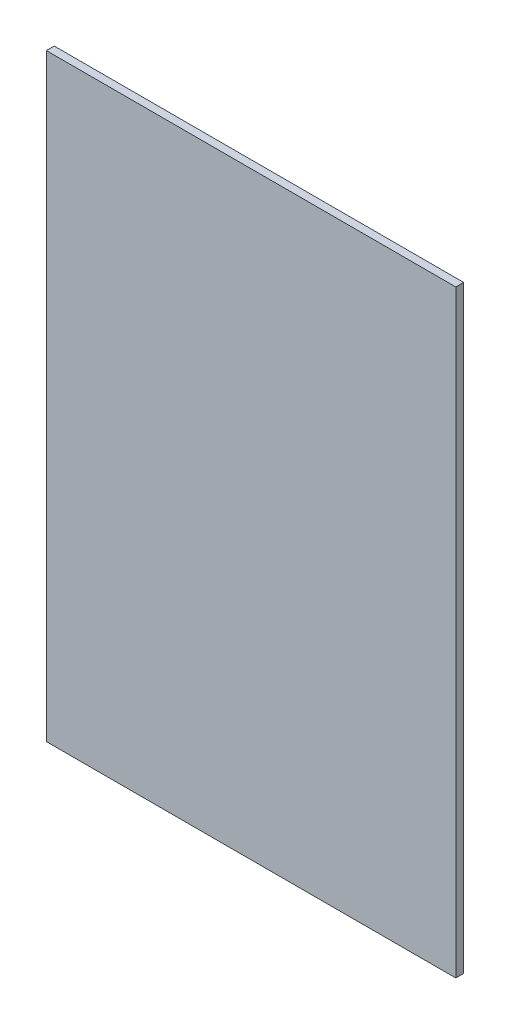
ISO-10303-21;
HEADER;
FILE_DESCRIPTION(('STEP AP214'),'2;1');
FILE_NAME('part.step','',(''),(''),'','','');
FILE_SCHEMA(('AUTOMOTIVE_DESIGN { 1 0 10303 214 1 1 1 1 }'));
ENDSEC;
DATA;
#1=APPLICATION_CONTEXT('core data for automotive mechanical design processes');
#2=APPLICATION_PROTOCOL_DEFINITION('international standard','automotive_design',2000,#1);
#3=PRODUCT_CONTEXT('',#1,'mechanical');
#4=PRODUCT('Part','Part','',(#3));
#5=PRODUCT_RELATED_PRODUCT_CATEGORY('part','',(#4));
#6=PRODUCT_DEFINITION_FORMATION('','',#4);
#7=PRODUCT_DEFINITION_CONTEXT('part definition',#1,'design');
#8=PRODUCT_DEFINITION('design','',#6,#7);
#9=PRODUCT_DEFINITION_SHAPE('','',#8);
#10=(LENGTH_UNIT() NAMED_UNIT(*) SI_UNIT(.MILLI.,.METRE.));
#11=(NAMED_UNIT(*) PLANE_ANGLE_UNIT() SI_UNIT($,.RADIAN.));
#12=(NAMED_UNIT(*) SI_UNIT($,.STERADIAN.) SOLID_ANGLE_UNIT());
#13=UNCERTAINTY_MEASURE_WITH_UNIT(LENGTH_MEASURE(1.E-05),#10,'distance_accuracy_value','');
#14=(GEOMETRIC_REPRESENTATION_CONTEXT(3) GLOBAL_UNCERTAINTY_ASSIGNED_CONTEXT((#13)) GLOBAL_UNIT_ASSIGNED_CONTEXT((#10,
#11,#12)) REPRESENTATION_CONTEXT('',''));
#15=CARTESIAN_POINT('',(0.,0.,0.));
#16=DIRECTION('',(0.,0.,1.));
#17=DIRECTION('',(1.,0.,0.));
#18=AXIS2_PLACEMENT_3D('',#15,#16,#17);
#19=CARTESIAN_POINT('',(130.,190.,2.5));
#20=DIRECTION('',(-1.,0.,0.));
#21=DIRECTION('',(0.,-1.,0.));
#22=AXIS2_PLACEMENT_3D('',#19,#20,#21);
#23=PLANE('',#22);
#24=DIRECTION('',(0.,1.,0.));
#25=VECTOR('',#24,1.);
#26=CARTESIAN_POINT('',(130.,190.,-2.5));
#27=LINE('',#26,#25);
#28=CARTESIAN_POINT('',(130.,-190.,-2.5));
#29=VERTEX_POINT('',#28);
#30=CARTESIAN_POINT('',(130.,190.,-2.5));
#31=VERTEX_POINT('',#30);
#32=EDGE_CURVE('E96',#29,#31,#27,.T.);
#33=ORIENTED_EDGE('',*,*,#32,.T.);
#34=DIRECTION('',(0.,0.,-1.));
#35=VECTOR('',#34,1.);
#36=CARTESIAN_POINT('',(130.,190.,2.5));
#37=LINE('',#36,#35);
#38=CARTESIAN_POINT('',(130.,190.,2.5));
#39=VERTEX_POINT('',#38);
#40=EDGE_CURVE('E11',#39,#31,#37,.T.);
#41=ORIENTED_EDGE('',*,*,#40,.F.);
#42=DIRECTION('',(0.,1.,0.));
#43=VECTOR('',#42,1.);
#44=CARTESIAN_POINT('',(130.,190.,2.5));
#45=LINE('',#44,#43);
#46=CARTESIAN_POINT('',(130.,-190.,2.5));
#47=VERTEX_POINT('',#46);
#48=EDGE_CURVE('E84',#47,#39,#45,.T.);
#49=ORIENTED_EDGE('',*,*,#48,.F.);
#50=DIRECTION('',(0.,0.,-1.));
#51=VECTOR('',#50,1.);
#52=CARTESIAN_POINT('',(130.,-190.,2.5));
#53=LINE('',#52,#51);
#54=EDGE_CURVE('E92',#47,#29,#53,.T.);
#55=ORIENTED_EDGE('',*,*,#54,.T.);
#56=EDGE_LOOP('',(#33,#41,#49,#55));
#57=FACE_BOUND('',#56,.T.);
#58=ADVANCED_FACE('F33',(#57),#23,.F.);
#59=CARTESIAN_POINT('',(-130.,190.,2.5));
#60=DIRECTION('',(0.,-1.,0.));
#61=DIRECTION('',(0.,0.,-1.));
#62=AXIS2_PLACEMENT_3D('',#59,#60,#61);
#63=PLANE('',#62);
#64=DIRECTION('',(-1.,0.,0.));
#65=VECTOR('',#64,1.);
#66=CARTESIAN_POINT('',(-130.,190.,-2.5));
#67=LINE('',#66,#65);
#68=CARTESIAN_POINT('',(-130.,190.,-2.5));
#69=VERTEX_POINT('',#68);
#70=EDGE_CURVE('E88',#31,#69,#67,.T.);
#71=ORIENTED_EDGE('',*,*,#70,.T.);
#72=DIRECTION('',(0.,0.,-1.));
#73=VECTOR('',#72,1.);
#74=CARTESIAN_POINT('',(-130.,190.,2.5));
#75=LINE('',#74,#73);
#76=CARTESIAN_POINT('',(-130.,190.,2.5));
#77=VERTEX_POINT('',#76);
#78=EDGE_CURVE('E41',#77,#69,#75,.T.);
#79=ORIENTED_EDGE('',*,*,#78,.F.);
#80=DIRECTION('',(-1.,0.,0.));
#81=VECTOR('',#80,1.);
#82=CARTESIAN_POINT('',(-130.,190.,2.5));
#83=LINE('',#82,#81);
#84=EDGE_CURVE('E79',#39,#77,#83,.T.);
#85=ORIENTED_EDGE('',*,*,#84,.F.);
#86=ORIENTED_EDGE('',*,*,#40,.T.);
#87=EDGE_LOOP('',(#71,#79,#85,#86));
#88=FACE_BOUND('',#87,.T.);
#89=ADVANCED_FACE('F87',(#88),#63,.F.);
#90=CARTESIAN_POINT('',(-130.,190.,2.5));
#91=DIRECTION('',(1.,0.,0.));
#92=DIRECTION('',(0.,1.,0.));
#93=AXIS2_PLACEMENT_3D('',#90,#91,#92);
#94=PLANE('',#93);
#95=DIRECTION('',(0.,-1.,0.));
#96=VECTOR('',#95,1.);
#97=CARTESIAN_POINT('',(-130.,190.,-2.5));
#98=LINE('',#97,#96);
#99=CARTESIAN_POINT('',(-130.,-190.,-2.5));
#100=VERTEX_POINT('',#99);
#101=EDGE_CURVE('E66',#69,#100,#98,.T.);
#102=ORIENTED_EDGE('',*,*,#101,.T.);
#103=DIRECTION('',(0.,0.,-1.));
#104=VECTOR('',#103,1.);
#105=CARTESIAN_POINT('',(-130.,-190.,2.5));
#106=LINE('',#105,#104);
#107=CARTESIAN_POINT('',(-130.,-190.,2.5));
#108=VERTEX_POINT('',#107);
#109=EDGE_CURVE('E89',#108,#100,#106,.T.);
#110=ORIENTED_EDGE('',*,*,#109,.F.);
#111=DIRECTION('',(0.,-1.,0.));
#112=VECTOR('',#111,1.);
#113=CARTESIAN_POINT('',(-130.,190.,2.5));
#114=LINE('',#113,#112);
#115=EDGE_CURVE('E82',#77,#108,#114,.T.);
#116=ORIENTED_EDGE('',*,*,#115,.F.);
#117=ORIENTED_EDGE('',*,*,#78,.T.);
#118=EDGE_LOOP('',(#102,#110,#116,#117));
#119=FACE_BOUND('',#118,.T.);
#120=ADVANCED_FACE('F90',(#119),#94,.F.);
#121=CARTESIAN_POINT('',(-130.,-190.,2.5));
#122=DIRECTION('',(0.,1.,0.));
#123=DIRECTION('',(0.,0.,1.));
#124=AXIS2_PLACEMENT_3D('',#121,#122,#123);
#125=PLANE('',#124);
#126=DIRECTION('',(1.,0.,0.));
#127=VECTOR('',#126,1.);
#128=CARTESIAN_POINT('',(-130.,-190.,-2.5));
#129=LINE('',#128,#127);
#130=EDGE_CURVE('E72',#100,#29,#129,.T.);
#131=ORIENTED_EDGE('',*,*,#130,.T.);
#132=ORIENTED_EDGE('',*,*,#54,.F.);
#133=DIRECTION('',(1.,0.,0.));
#134=VECTOR('',#133,1.);
#135=CARTESIAN_POINT('',(-130.,-190.,2.5));
#136=LINE('',#135,#134);
#137=EDGE_CURVE('E49',#108,#47,#136,.T.);
#138=ORIENTED_EDGE('',*,*,#137,.F.);
#139=ORIENTED_EDGE('',*,*,#109,.T.);
#140=EDGE_LOOP('',(#131,#132,#138,#139));
#141=FACE_BOUND('',#140,.T.);
#142=ADVANCED_FACE('F103',(#141),#125,.F.);
#143=CARTESIAN_POINT('',(0.,0.,2.5));
#144=DIRECTION('',(0.,0.,1.));
#145=DIRECTION('',(1.,0.,0.));
#146=AXIS2_PLACEMENT_3D('',#143,#144,#145);
#147=PLANE('',#146);
#148=ORIENTED_EDGE('',*,*,#48,.T.);
#149=ORIENTED_EDGE('',*,*,#84,.T.);
#150=ORIENTED_EDGE('',*,*,#115,.T.);
#151=ORIENTED_EDGE('',*,*,#137,.T.);
#152=EDGE_LOOP('',(#148,#149,#150,#151));
#153=FACE_BOUND('',#152,.T.);
#154=ADVANCED_FACE('F80',(#153),#147,.T.);
#155=CARTESIAN_POINT('',(0.,0.,-2.5));
#156=DIRECTION('',(0.,0.,1.));
#157=DIRECTION('',(1.,0.,0.));
#158=AXIS2_PLACEMENT_3D('',#155,#156,#157);
#159=PLANE('',#158);
#160=ORIENTED_EDGE('',*,*,#32,.F.);
#161=ORIENTED_EDGE('',*,*,#130,.F.);
#162=ORIENTED_EDGE('',*,*,#101,.F.);
#163=ORIENTED_EDGE('',*,*,#70,.F.);
#164=EDGE_LOOP('',(#160,#161,#162,#163));
#165=FACE_BOUND('',#164,.T.);
#166=ADVANCED_FACE('F106',(#165),#159,.F.);
#167=CLOSED_SHELL('',(#58,#89,#120,#142,#154,#166));
#168=MANIFOLD_SOLID_BREP('B2',#167);
#169=ADVANCED_BREP_SHAPE_REPRESENTATION('',(#18,#168),#14);
#170=SHAPE_DEFINITION_REPRESENTATION(#9,#169);
ENDSEC;
END-ISO-10303-21;
